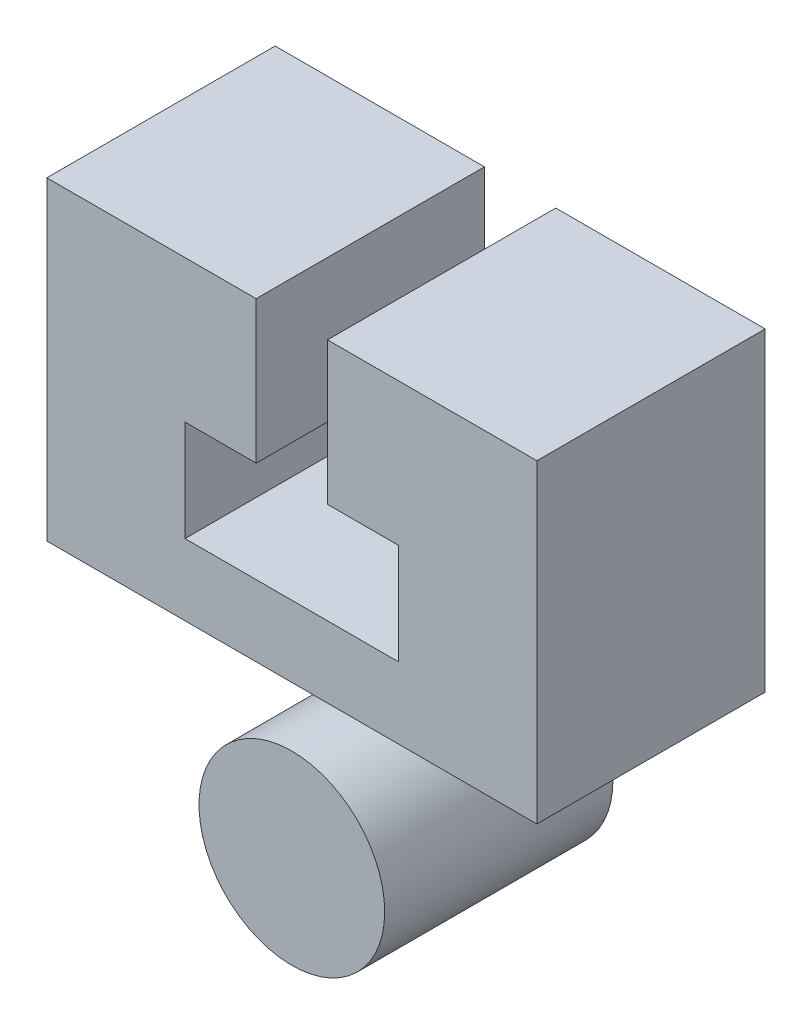
ISO-10303-21;
HEADER;
FILE_DESCRIPTION(('STEP AP214'),'2;1');
FILE_NAME('part.step','',(''),(''),'','','');
FILE_SCHEMA(('AUTOMOTIVE_DESIGN { 1 0 10303 214 1 1 1 1 }'));
ENDSEC;
DATA;
#1=APPLICATION_CONTEXT('core data for automotive mechanical design processes');
#2=APPLICATION_PROTOCOL_DEFINITION('international standard','automotive_design',2000,#1);
#3=PRODUCT_CONTEXT('',#1,'mechanical');
#4=PRODUCT('Part','Part','',(#3));
#5=PRODUCT_RELATED_PRODUCT_CATEGORY('part','',(#4));
#6=PRODUCT_DEFINITION_FORMATION('','',#4);
#7=PRODUCT_DEFINITION_CONTEXT('part definition',#1,'design');
#8=PRODUCT_DEFINITION('design','',#6,#7);
#9=PRODUCT_DEFINITION_SHAPE('','',#8);
#10=(LENGTH_UNIT() NAMED_UNIT(*) SI_UNIT(.MILLI.,.METRE.));
#11=(NAMED_UNIT(*) PLANE_ANGLE_UNIT() SI_UNIT($,.RADIAN.));
#12=(NAMED_UNIT(*) SI_UNIT($,.STERADIAN.) SOLID_ANGLE_UNIT());
#13=UNCERTAINTY_MEASURE_WITH_UNIT(LENGTH_MEASURE(1.E-05),#10,'distance_accuracy_value','');
#14=(GEOMETRIC_REPRESENTATION_CONTEXT(3) GLOBAL_UNCERTAINTY_ASSIGNED_CONTEXT((#13)) GLOBAL_UNIT_ASSIGNED_CONTEXT((#10,
#11,#12)) REPRESENTATION_CONTEXT('',''));
#15=CARTESIAN_POINT('',(0.,0.,0.));
#16=DIRECTION('',(0.,0.,1.));
#17=DIRECTION('',(1.,0.,0.));
#18=AXIS2_PLACEMENT_3D('',#15,#16,#17);
#19=CARTESIAN_POINT('',(40.894,77.9018,97.189073188502));
#20=DIRECTION('',(0.,1.,0.));
#21=DIRECTION('',(0.,0.,1.));
#22=AXIS2_PLACEMENT_3D('',#19,#20,#21);
#23=PLANE('',#22);
#24=DIRECTION('',(0.,0.,-1.));
#25=VECTOR('',#24,1.);
#26=CARTESIAN_POINT('',(-5.9554872,77.9018,0.));
#27=LINE('',#26,#25);
#28=CARTESIAN_POINT('',(-5.9554872,77.9018,0.));
#29=VERTEX_POINT('',#28);
#30=CARTESIAN_POINT('',(-5.9554872,77.9018,-38.1));
#31=VERTEX_POINT('',#30);
#32=EDGE_CURVE('E293',#29,#31,#27,.T.);
#33=ORIENTED_EDGE('',*,*,#32,.T.);
#34=DIRECTION('',(1.,0.,0.));
#35=VECTOR('',#34,1.);
#36=CARTESIAN_POINT('',(40.894,77.9018,-38.1));
#37=LINE('',#36,#35);
#38=CARTESIAN_POINT('',(-40.894,77.9018,-38.1));
#39=VERTEX_POINT('',#38);
#40=EDGE_CURVE('E239',#39,#31,#37,.T.);
#41=ORIENTED_EDGE('',*,*,#40,.F.);
#42=DIRECTION('',(0.,0.,-1.));
#43=VECTOR('',#42,1.);
#44=CARTESIAN_POINT('',(-40.894,77.9018,97.189073188502));
#45=LINE('',#44,#43);
#46=CARTESIAN_POINT('',(-40.894,77.9018,0.));
#47=VERTEX_POINT('',#46);
#48=EDGE_CURVE('E251',#47,#39,#45,.T.);
#49=ORIENTED_EDGE('',*,*,#48,.F.);
#50=DIRECTION('',(1.,0.,0.));
#51=VECTOR('',#50,1.);
#52=CARTESIAN_POINT('',(40.894,77.9018,0.));
#53=LINE('',#52,#51);
#54=EDGE_CURVE('E318',#47,#29,#53,.T.);
#55=ORIENTED_EDGE('',*,*,#54,.T.);
#56=EDGE_LOOP('',(#33,#41,#49,#55));
#57=FACE_BOUND('',#56,.T.);
#58=ADVANCED_FACE('F52',(#57),#23,.T.);
#59=CARTESIAN_POINT('',(0.,0.,-38.1));
#60=DIRECTION('',(0.,0.,1.));
#61=DIRECTION('',(1.,0.,0.));
#62=AXIS2_PLACEMENT_3D('',#59,#60,#61);
#63=CYLINDRICAL_SURFACE('',#62,15.494);
#64=CARTESIAN_POINT('',(0.,0.,-25.6032));
#65=DIRECTION('',(0.,0.,-1.));
#66=DIRECTION('',(-1.,0.,0.));
#67=AXIS2_PLACEMENT_3D('',#64,#65,#66);
#68=CIRCLE('',#67,15.494);
#69=CARTESIAN_POINT('',(15.494,0.,-25.6032));
#70=VERTEX_POINT('',#69);
#71=CARTESIAN_POINT('',(-15.494,0.,-25.6032));
#72=VERTEX_POINT('',#71);
#73=EDGE_CURVE('E434',#70,#72,#68,.F.);
#74=ORIENTED_EDGE('',*,*,#73,.T.);
#75=DIRECTION('',(0.,0.,-1.));
#76=VECTOR('',#75,1.);
#77=CARTESIAN_POINT('',(-15.494,0.,-30.6832));
#78=LINE('',#77,#76);
#79=CARTESIAN_POINT('',(-15.494,0.,-38.1));
#80=VERTEX_POINT('',#79);
#81=EDGE_CURVE('E412',#72,#80,#78,.T.);
#82=ORIENTED_EDGE('',*,*,#81,.T.);
#83=CARTESIAN_POINT('',(0.,0.,-38.1));
#84=DIRECTION('',(0.,0.,1.));
#85=DIRECTION('',(1.,0.,0.));
#86=AXIS2_PLACEMENT_3D('',#83,#84,#85);
#87=CIRCLE('',#86,15.494);
#88=CARTESIAN_POINT('',(15.494,0.,-38.1));
#89=VERTEX_POINT('',#88);
#90=EDGE_CURVE('E432',#80,#89,#87,.T.);
#91=ORIENTED_EDGE('',*,*,#90,.T.);
#92=DIRECTION('',(0.,0.,-1.));
#93=VECTOR('',#92,1.);
#94=CARTESIAN_POINT('',(15.494,0.,-30.6832));
#95=LINE('',#94,#93);
#96=EDGE_CURVE('E417',#70,#89,#95,.T.);
#97=ORIENTED_EDGE('',*,*,#96,.F.);
#98=EDGE_LOOP('',(#74,#82,#91,#97));
#99=FACE_BOUND('',#98,.T.);
#100=CARTESIAN_POINT('',(0.,0.,0.));
#101=DIRECTION('',(0.,0.,1.));
#102=DIRECTION('',(1.,0.,0.));
#103=AXIS2_PLACEMENT_3D('',#100,#101,#102);
#104=CIRCLE('',#103,15.494);
#105=CARTESIAN_POINT('',(15.494,0.,0.));
#106=VERTEX_POINT('',#105);
#107=EDGE_CURVE('E421',#106,#106,#104,.T.);
#108=ORIENTED_EDGE('',*,*,#107,.F.);
#109=EDGE_LOOP('',(#108));
#110=FACE_BOUND('',#109,.T.);
#111=ADVANCED_FACE('F355',(#99,#110),#63,.T.);
#112=CARTESIAN_POINT('',(0.,0.,-38.1));
#113=DIRECTION('',(0.,0.,1.));
#114=DIRECTION('',(1.,0.,0.));
#115=AXIS2_PLACEMENT_3D('',#112,#113,#114);
#116=PLANE('',#115);
#117=ORIENTED_EDGE('',*,*,#40,.T.);
#118=DIRECTION('',(0.,1.,0.));
#119=VECTOR('',#118,1.);
#120=CARTESIAN_POINT('',(-5.9554872,54.1274,-38.1));
#121=LINE('',#120,#119);
#122=CARTESIAN_POINT('',(-5.9554872,54.1274,-38.1));
#123=VERTEX_POINT('',#122);
#124=EDGE_CURVE('E207',#123,#31,#121,.T.);
#125=ORIENTED_EDGE('',*,*,#124,.F.);
#126=DIRECTION('',(1.,0.,0.));
#127=VECTOR('',#126,1.);
#128=CARTESIAN_POINT('',(-17.8308,54.1274,-38.1));
#129=LINE('',#128,#127);
#130=CARTESIAN_POINT('',(-17.8308,54.1274,-38.1));
#131=VERTEX_POINT('',#130);
#132=EDGE_CURVE('E210',#131,#123,#129,.T.);
#133=ORIENTED_EDGE('',*,*,#132,.F.);
#134=DIRECTION('',(0.,1.,0.));
#135=VECTOR('',#134,1.);
#136=CARTESIAN_POINT('',(-17.8308,37.2872,-38.1));
#137=LINE('',#136,#135);
#138=CARTESIAN_POINT('',(-17.8308,37.2872,-38.1));
#139=VERTEX_POINT('',#138);
#140=EDGE_CURVE('E283',#139,#131,#137,.T.);
#141=ORIENTED_EDGE('',*,*,#140,.F.);
#142=DIRECTION('',(-1.,0.,0.));
#143=VECTOR('',#142,1.);
#144=CARTESIAN_POINT('',(17.8308,37.2872,-38.1));
#145=LINE('',#144,#143);
#146=CARTESIAN_POINT('',(17.8308,37.2872,-38.1));
#147=VERTEX_POINT('',#146);
#148=EDGE_CURVE('E279',#147,#139,#145,.T.);
#149=ORIENTED_EDGE('',*,*,#148,.F.);
#150=DIRECTION('',(0.,-1.,0.));
#151=VECTOR('',#150,1.);
#152=CARTESIAN_POINT('',(17.8308,54.1274,-38.1));
#153=LINE('',#152,#151);
#154=CARTESIAN_POINT('',(17.8308,54.1274,-38.1));
#155=VERTEX_POINT('',#154);
#156=EDGE_CURVE('E271',#155,#147,#153,.T.);
#157=ORIENTED_EDGE('',*,*,#156,.F.);
#158=DIRECTION('',(1.,0.,0.));
#159=VECTOR('',#158,1.);
#160=CARTESIAN_POINT('',(5.94478872,54.1274,-38.1));
#161=LINE('',#160,#159);
#162=CARTESIAN_POINT('',(5.94478872,54.1274,-38.1));
#163=VERTEX_POINT('',#162);
#164=EDGE_CURVE('E273',#163,#155,#161,.T.);
#165=ORIENTED_EDGE('',*,*,#164,.F.);
#166=DIRECTION('',(0.,-1.,0.));
#167=VECTOR('',#166,1.);
#168=CARTESIAN_POINT('',(5.94478872,77.9018,-38.1));
#169=LINE('',#168,#167);
#170=CARTESIAN_POINT('',(5.94478872,77.9018,-38.1));
#171=VERTEX_POINT('',#170);
#172=EDGE_CURVE('E184',#171,#163,#169,.T.);
#173=ORIENTED_EDGE('',*,*,#172,.F.);
#174=CARTESIAN_POINT('',(40.894,77.9018,-38.1));
#175=VERTEX_POINT('',#174);
#176=EDGE_CURVE('E243',#171,#175,#37,.T.);
#177=ORIENTED_EDGE('',*,*,#176,.T.);
#178=DIRECTION('',(0.,-1.,0.));
#179=VECTOR('',#178,1.);
#180=CARTESIAN_POINT('',(40.894,25.4,-38.1));
#181=LINE('',#180,#179);
#182=CARTESIAN_POINT('',(40.894,25.4,-38.1));
#183=VERTEX_POINT('',#182);
#184=EDGE_CURVE('E234',#175,#183,#181,.T.);
#185=ORIENTED_EDGE('',*,*,#184,.T.);
#186=DIRECTION('',(-1.,0.,0.));
#187=VECTOR('',#186,1.);
#188=CARTESIAN_POINT('',(15.494,25.4,-38.1));
#189=LINE('',#188,#187);
#190=CARTESIAN_POINT('',(15.494,25.4,-38.1));
#191=VERTEX_POINT('',#190);
#192=EDGE_CURVE('E228',#183,#191,#189,.T.);
#193=ORIENTED_EDGE('',*,*,#192,.T.);
#194=DIRECTION('',(0.,-1.,0.));
#195=VECTOR('',#194,1.);
#196=CARTESIAN_POINT('',(15.494,0.,-38.1));
#197=LINE('',#196,#195);
#198=EDGE_CURVE('E399',#191,#89,#197,.T.);
#199=ORIENTED_EDGE('',*,*,#198,.T.);
#200=ORIENTED_EDGE('',*,*,#90,.F.);
#201=DIRECTION('',(0.,1.,0.));
#202=VECTOR('',#201,1.);
#203=CARTESIAN_POINT('',(-15.494,25.4,-38.1));
#204=LINE('',#203,#202);
#205=CARTESIAN_POINT('',(-15.494,25.4,-38.1));
#206=VERTEX_POINT('',#205);
#207=EDGE_CURVE('E393',#80,#206,#204,.T.);
#208=ORIENTED_EDGE('',*,*,#207,.T.);
#209=CARTESIAN_POINT('',(-40.894,25.4,-38.1));
#210=VERTEX_POINT('',#209);
#211=EDGE_CURVE('E233',#206,#210,#189,.T.);
#212=ORIENTED_EDGE('',*,*,#211,.T.);
#213=DIRECTION('',(0.,1.,0.));
#214=VECTOR('',#213,1.);
#215=CARTESIAN_POINT('',(-40.894,77.9018,-38.1));
#216=LINE('',#215,#214);
#217=EDGE_CURVE('E232',#210,#39,#216,.T.);
#218=ORIENTED_EDGE('',*,*,#217,.T.);
#219=EDGE_LOOP('',(#117,#125,#133,#141,#149,#157,#165,#173,#177,#185,#193,#199,#200,#208,#212,#218));
#220=FACE_BOUND('',#219,.T.);
#221=ADVANCED_FACE('F277',(#220),#116,.F.);
#222=CARTESIAN_POINT('',(0.,0.,0.));
#223=DIRECTION('',(0.,0.,1.));
#224=DIRECTION('',(1.,0.,0.));
#225=AXIS2_PLACEMENT_3D('',#222,#223,#224);
#226=PLANE('',#225);
#227=ORIENTED_EDGE('',*,*,#107,.T.);
#228=EDGE_LOOP('',(#227));
#229=FACE_BOUND('',#228,.T.);
#230=ADVANCED_FACE('F458',(#229),#226,.T.);
#231=CARTESIAN_POINT('',(15.494,0.,-30.6832));
#232=DIRECTION('',(1.,0.,0.));
#233=DIRECTION('',(0.,0.,-1.));
#234=AXIS2_PLACEMENT_3D('',#231,#232,#233);
#235=PLANE('',#234);
#236=ORIENTED_EDGE('',*,*,#198,.F.);
#237=DIRECTION('',(0.,0.,-1.));
#238=VECTOR('',#237,1.);
#239=CARTESIAN_POINT('',(15.494,25.4,-30.6832));
#240=LINE('',#239,#238);
#241=CARTESIAN_POINT('',(15.494,25.4,-30.6832));
#242=VERTEX_POINT('',#241);
#243=EDGE_CURVE('E422',#242,#191,#240,.T.);
#244=ORIENTED_EDGE('',*,*,#243,.F.);
#245=DIRECTION('',(0.,-1.,0.));
#246=VECTOR('',#245,1.);
#247=CARTESIAN_POINT('',(15.494,0.,-30.6832));
#248=LINE('',#247,#246);
#249=CARTESIAN_POINT('',(15.494,13.5360791959858,-30.6832));
#250=VERTEX_POINT('',#249);
#251=EDGE_CURVE('E410',#242,#250,#248,.T.);
#252=ORIENTED_EDGE('',*,*,#251,.T.);
#253=CARTESIAN_POINT('',(15.494,13.5360791959858,-30.6832));
#254=CARTESIAN_POINT('',(15.494,13.3421272709523,-30.6831931030834));
#255=CARTESIAN_POINT('',(15.494,13.1482261054772,-30.6783928912099));
#256=CARTESIAN_POINT('',(15.494,12.7609153638539,-30.6598653900687));
#257=CARTESIAN_POINT('',(15.494,12.5675056366207,-30.646141295976));
#258=CARTESIAN_POINT('',(15.494,11.9892506565346,-30.5926459259166));
#259=CARTESIAN_POINT('',(15.494,11.6055123749205,-30.5405455888845));
#260=CARTESIAN_POINT('',(15.494,10.8484999570026,-30.4091153210755));
#261=CARTESIAN_POINT('',(15.494,10.4751545993975,-30.3301820572617));
#262=CARTESIAN_POINT('',(15.494,9.73402635991413,-30.1488851474403));
#263=CARTESIAN_POINT('',(15.494,9.36624686018778,-30.0465078203666));
#264=CARTESIAN_POINT('',(15.494,8.60547247148766,-29.8122329075534));
#265=CARTESIAN_POINT('',(15.494,8.21303130981734,-29.6785530886733));
#266=CARTESIAN_POINT('',(15.494,7.43526363483879,-29.3917523714856));
#267=CARTESIAN_POINT('',(15.494,7.04993914296578,-29.2386260439419));
#268=CARTESIAN_POINT('',(15.494,6.28574403572504,-28.9163866771008));
#269=CARTESIAN_POINT('',(15.494,5.90687845510789,-28.7472617841115));
#270=CARTESIAN_POINT('',(15.494,5.15507440637771,-28.3962644606188));
#271=CARTESIAN_POINT('',(15.494,4.78213675610768,-28.2143902895777));
#272=CARTESIAN_POINT('',(15.494,3.66624790854189,-27.65171831166));
#273=CARTESIAN_POINT('',(15.494,2.93090574089442,-27.2559282762233));
#274=CARTESIAN_POINT('',(15.494,1.47089475384428,-26.4453151102772));
#275=CARTESIAN_POINT('',(15.494,0.746228260195783,-26.030487911109));
#276=CARTESIAN_POINT('',(15.494,0.0144026681147942,-25.6114469428914));
#277=CARTESIAN_POINT('',(15.494,0.00720133460943791,-25.6073234712985));
#278=CARTESIAN_POINT('',(15.494,0.,-25.6032));
#279=B_SPLINE_CURVE_WITH_KNOTS('',3,(#253,#254,#255,#256,#257,#258,#259,#260,#261,#262,#263,
#264,#265,#266,#267,#268,#269,#270,#271,#272,#273,#274,#275,#276,#277,#278),.UNSPECIFIED.,.F.,
.F.,(4,2,2,2,2,2,2,2,2,2,2,2,4),(0.,0.581713359913225,1.16321855332281,2.32363643204806,
3.46759653804617,4.61222592469933,5.85535820072218,7.09883831077744,8.34324706879805,
9.58782604622115,12.0923097935322,14.5973313195761,14.6222262989917),.UNSPECIFIED.);
#280=EDGE_CURVE('E12',#250,#70,#279,.T.);
#281=ORIENTED_EDGE('',*,*,#280,.T.);
#282=ORIENTED_EDGE('',*,*,#96,.T.);
#283=EDGE_LOOP('',(#236,#244,#252,#281,#282));
#284=FACE_BOUND('',#283,.T.);
#285=ADVANCED_FACE('F454',(#284),#235,.T.);
#286=CARTESIAN_POINT('',(-15.494,25.4,-30.6832));
#287=DIRECTION('',(-1.,0.,0.));
#288=DIRECTION('',(0.,0.,1.));
#289=AXIS2_PLACEMENT_3D('',#286,#287,#288);
#290=PLANE('',#289);
#291=ORIENTED_EDGE('',*,*,#207,.F.);
#292=ORIENTED_EDGE('',*,*,#81,.F.);
#293=CARTESIAN_POINT('',(-15.494,13.5360791959858,-30.6832));
#294=CARTESIAN_POINT('',(-15.494,13.3421272709523,-30.6831931030834));
#295=CARTESIAN_POINT('',(-15.494,13.1482261054772,-30.6783928912099));
#296=CARTESIAN_POINT('',(-15.494,12.7609153638539,-30.6598653900687));
#297=CARTESIAN_POINT('',(-15.494,12.5675056366207,-30.646141295976));
#298=CARTESIAN_POINT('',(-15.494,11.9892506565346,-30.5926459259166));
#299=CARTESIAN_POINT('',(-15.494,11.6055123749205,-30.5405455888845));
#300=CARTESIAN_POINT('',(-15.494,10.8484999570026,-30.4091153210755));
#301=CARTESIAN_POINT('',(-15.494,10.4751545993975,-30.3301820572617));
#302=CARTESIAN_POINT('',(-15.494,9.73402635991413,-30.1488851474403));
#303=CARTESIAN_POINT('',(-15.494,9.36624686018778,-30.0465078203666));
#304=CARTESIAN_POINT('',(-15.494,8.60547247148766,-29.8122329075534));
#305=CARTESIAN_POINT('',(-15.494,8.21303130981734,-29.6785530886733));
#306=CARTESIAN_POINT('',(-15.494,7.43526363483879,-29.3917523714856));
#307=CARTESIAN_POINT('',(-15.494,7.04993914296578,-29.2386260439419));
#308=CARTESIAN_POINT('',(-15.494,6.28574403572504,-28.9163866771008));
#309=CARTESIAN_POINT('',(-15.494,5.90687845510789,-28.7472617841115));
#310=CARTESIAN_POINT('',(-15.494,5.15507440637771,-28.3962644606188));
#311=CARTESIAN_POINT('',(-15.494,4.78213675610768,-28.2143902895777));
#312=CARTESIAN_POINT('',(-15.494,3.66624790854189,-27.65171831166));
#313=CARTESIAN_POINT('',(-15.494,2.93090574089442,-27.2559282762233));
#314=CARTESIAN_POINT('',(-15.494,1.47089475384428,-26.4453151102772));
#315=CARTESIAN_POINT('',(-15.494,0.746228260195783,-26.030487911109));
#316=CARTESIAN_POINT('',(-15.494,0.0144026681147942,-25.6114469428914));
#317=CARTESIAN_POINT('',(-15.494,0.00720133460943791,-25.6073234712985));
#318=CARTESIAN_POINT('',(-15.494,0.,-25.6032));
#319=B_SPLINE_CURVE_WITH_KNOTS('',3,(#293,#294,#295,#296,#297,#298,#299,#300,#301,#302,#303,
#304,#305,#306,#307,#308,#309,#310,#311,#312,#313,#314,#315,#316,#317,#318),.UNSPECIFIED.,.F.,
.F.,(4,2,2,2,2,2,2,2,2,2,2,2,4),(0.,0.581713359913225,1.16321855332281,2.32363643204806,
3.46759653804617,4.61222592469933,5.85535820072218,7.09883831077744,8.34324706879805,
9.58782604622115,12.0923097935322,14.5973313195761,14.6222262989917),.UNSPECIFIED.);
#320=CARTESIAN_POINT('',(-15.494,13.5360791959858,-30.6832));
#321=VERTEX_POINT('',#320);
#322=EDGE_CURVE('E67',#72,#321,#319,.F.);
#323=ORIENTED_EDGE('',*,*,#322,.T.);
#324=DIRECTION('',(0.,1.,0.));
#325=VECTOR('',#324,1.);
#326=CARTESIAN_POINT('',(-15.494,25.4,-30.6832));
#327=LINE('',#326,#325);
#328=CARTESIAN_POINT('',(-15.494,25.4,-30.6832));
#329=VERTEX_POINT('',#328);
#330=EDGE_CURVE('E403',#321,#329,#327,.T.);
#331=ORIENTED_EDGE('',*,*,#330,.T.);
#332=DIRECTION('',(0.,0.,-1.));
#333=VECTOR('',#332,1.);
#334=CARTESIAN_POINT('',(-15.494,25.4,-30.6832));
#335=LINE('',#334,#333);
#336=EDGE_CURVE('E426',#329,#206,#335,.T.);
#337=ORIENTED_EDGE('',*,*,#336,.T.);
#338=EDGE_LOOP('',(#291,#292,#323,#331,#337));
#339=FACE_BOUND('',#338,.T.);
#340=ADVANCED_FACE('F449',(#339),#290,.T.);
#341=CARTESIAN_POINT('',(0.,0.,-30.6832));
#342=DIRECTION('',(0.,0.,-1.));
#343=DIRECTION('',(-1.,0.,0.));
#344=AXIS2_PLACEMENT_3D('',#341,#342,#343);
#345=PLANE('',#344);
#346=ORIENTED_EDGE('',*,*,#330,.F.);
#347=CARTESIAN_POINT('',(0.,0.,-30.6832));
#348=DIRECTION('',(0.,0.,-1.));
#349=DIRECTION('',(-1.,0.,0.));
#350=AXIS2_PLACEMENT_3D('',#347,#348,#349);
#351=CIRCLE('',#350,20.574);
#352=EDGE_CURVE('E80',#321,#250,#351,.T.);
#353=ORIENTED_EDGE('',*,*,#352,.T.);
#354=ORIENTED_EDGE('',*,*,#251,.F.);
#355=DIRECTION('',(1.,0.,0.));
#356=VECTOR('',#355,1.);
#357=CARTESIAN_POINT('',(15.494,25.4,-30.6832));
#358=LINE('',#357,#356);
#359=EDGE_CURVE('E406',#329,#242,#358,.T.);
#360=ORIENTED_EDGE('',*,*,#359,.F.);
#361=EDGE_LOOP('',(#346,#353,#354,#360));
#362=FACE_BOUND('',#361,.T.);
#363=ADVANCED_FACE('F453',(#362),#345,.F.);
#364=CARTESIAN_POINT('',(15.494,25.4,97.189073188502));
#365=DIRECTION('',(0.,-1.,0.));
#366=DIRECTION('',(0.,0.,-1.));
#367=AXIS2_PLACEMENT_3D('',#364,#365,#366);
#368=PLANE('',#367);
#369=ORIENTED_EDGE('',*,*,#336,.F.);
#370=ORIENTED_EDGE('',*,*,#359,.T.);
#371=ORIENTED_EDGE('',*,*,#243,.T.);
#372=ORIENTED_EDGE('',*,*,#192,.F.);
#373=DIRECTION('',(0.,0.,-1.));
#374=VECTOR('',#373,1.);
#375=CARTESIAN_POINT('',(40.894,25.4,97.189073188502));
#376=LINE('',#375,#374);
#377=CARTESIAN_POINT('',(40.894,25.4,0.));
#378=VERTEX_POINT('',#377);
#379=EDGE_CURVE('E329',#378,#183,#376,.T.);
#380=ORIENTED_EDGE('',*,*,#379,.F.);
#381=DIRECTION('',(-1.,0.,0.));
#382=VECTOR('',#381,1.);
#383=CARTESIAN_POINT('',(15.494,25.4,0.));
#384=LINE('',#383,#382);
#385=CARTESIAN_POINT('',(-40.894,25.4,0.));
#386=VERTEX_POINT('',#385);
#387=EDGE_CURVE('E252',#378,#386,#384,.T.);
#388=ORIENTED_EDGE('',*,*,#387,.T.);
#389=DIRECTION('',(0.,0.,-1.));
#390=VECTOR('',#389,1.);
#391=CARTESIAN_POINT('',(-40.894,25.4,97.189073188502));
#392=LINE('',#391,#390);
#393=EDGE_CURVE('E389',#386,#210,#392,.T.);
#394=ORIENTED_EDGE('',*,*,#393,.T.);
#395=ORIENTED_EDGE('',*,*,#211,.F.);
#396=EDGE_LOOP('',(#369,#370,#371,#372,#380,#388,#394,#395));
#397=FACE_BOUND('',#396,.T.);
#398=ADVANCED_FACE('F472',(#397),#368,.T.);
#399=CARTESIAN_POINT('',(0.,0.,0.));
#400=DIRECTION('',(0.,0.,1.));
#401=DIRECTION('',(1.,0.,0.));
#402=AXIS2_PLACEMENT_3D('',#399,#400,#401);
#403=PLANE('',#402);
#404=DIRECTION('',(0.,1.,0.));
#405=VECTOR('',#404,1.);
#406=CARTESIAN_POINT('',(-5.9554872,54.1274,0.));
#407=LINE('',#406,#405);
#408=CARTESIAN_POINT('',(-5.9554872,54.1274,0.));
#409=VERTEX_POINT('',#408);
#410=EDGE_CURVE('E227',#409,#29,#407,.T.);
#411=ORIENTED_EDGE('',*,*,#410,.T.);
#412=ORIENTED_EDGE('',*,*,#54,.F.);
#413=DIRECTION('',(0.,1.,0.));
#414=VECTOR('',#413,1.);
#415=CARTESIAN_POINT('',(-40.894,77.9018,0.));
#416=LINE('',#415,#414);
#417=EDGE_CURVE('E238',#386,#47,#416,.T.);
#418=ORIENTED_EDGE('',*,*,#417,.F.);
#419=ORIENTED_EDGE('',*,*,#387,.F.);
#420=DIRECTION('',(0.,-1.,0.));
#421=VECTOR('',#420,1.);
#422=CARTESIAN_POINT('',(40.894,25.4,0.));
#423=LINE('',#422,#421);
#424=CARTESIAN_POINT('',(40.894,77.9018,0.));
#425=VERTEX_POINT('',#424);
#426=EDGE_CURVE('E325',#425,#378,#423,.T.);
#427=ORIENTED_EDGE('',*,*,#426,.F.);
#428=CARTESIAN_POINT('',(5.94478872,77.9018,0.));
#429=VERTEX_POINT('',#428);
#430=EDGE_CURVE('E205',#429,#425,#53,.T.);
#431=ORIENTED_EDGE('',*,*,#430,.F.);
#432=DIRECTION('',(0.,-1.,0.));
#433=VECTOR('',#432,1.);
#434=CARTESIAN_POINT('',(5.94478872,77.9018,0.));
#435=LINE('',#434,#433);
#436=CARTESIAN_POINT('',(5.94478872,54.1274,0.));
#437=VERTEX_POINT('',#436);
#438=EDGE_CURVE('E181',#429,#437,#435,.T.);
#439=ORIENTED_EDGE('',*,*,#438,.T.);
#440=DIRECTION('',(1.,0.,0.));
#441=VECTOR('',#440,1.);
#442=CARTESIAN_POINT('',(5.94478872,54.1274,0.));
#443=LINE('',#442,#441);
#444=CARTESIAN_POINT('',(17.8308,54.1274,0.));
#445=VERTEX_POINT('',#444);
#446=EDGE_CURVE('E193',#437,#445,#443,.T.);
#447=ORIENTED_EDGE('',*,*,#446,.T.);
#448=DIRECTION('',(0.,-1.,0.));
#449=VECTOR('',#448,1.);
#450=CARTESIAN_POINT('',(17.8308,54.1274,0.));
#451=LINE('',#450,#449);
#452=CARTESIAN_POINT('',(17.8308,37.2872,0.));
#453=VERTEX_POINT('',#452);
#454=EDGE_CURVE('E199',#445,#453,#451,.T.);
#455=ORIENTED_EDGE('',*,*,#454,.T.);
#456=DIRECTION('',(-1.,0.,0.));
#457=VECTOR('',#456,1.);
#458=CARTESIAN_POINT('',(17.8308,37.2872,0.));
#459=LINE('',#458,#457);
#460=CARTESIAN_POINT('',(-17.8308,37.2872,0.));
#461=VERTEX_POINT('',#460);
#462=EDGE_CURVE('E340',#453,#461,#459,.T.);
#463=ORIENTED_EDGE('',*,*,#462,.T.);
#464=DIRECTION('',(0.,1.,0.));
#465=VECTOR('',#464,1.);
#466=CARTESIAN_POINT('',(-17.8308,37.2872,0.));
#467=LINE('',#466,#465);
#468=CARTESIAN_POINT('',(-17.8308,54.1274,0.));
#469=VERTEX_POINT('',#468);
#470=EDGE_CURVE('E337',#461,#469,#467,.T.);
#471=ORIENTED_EDGE('',*,*,#470,.T.);
#472=DIRECTION('',(1.,0.,0.));
#473=VECTOR('',#472,1.);
#474=CARTESIAN_POINT('',(-17.8308,54.1274,0.));
#475=LINE('',#474,#473);
#476=EDGE_CURVE('E308',#469,#409,#475,.T.);
#477=ORIENTED_EDGE('',*,*,#476,.T.);
#478=EDGE_LOOP('',(#411,#412,#418,#419,#427,#431,#439,#447,#455,#463,#471,#477));
#479=FACE_BOUND('',#478,.T.);
#480=ADVANCED_FACE('F203',(#479),#403,.T.);
#481=CARTESIAN_POINT('',(-40.894,77.9018,97.189073188502));
#482=DIRECTION('',(-1.,0.,0.));
#483=DIRECTION('',(0.,0.,1.));
#484=AXIS2_PLACEMENT_3D('',#481,#482,#483);
#485=PLANE('',#484);
#486=ORIENTED_EDGE('',*,*,#393,.F.);
#487=ORIENTED_EDGE('',*,*,#417,.T.);
#488=ORIENTED_EDGE('',*,*,#48,.T.);
#489=ORIENTED_EDGE('',*,*,#217,.F.);
#490=EDGE_LOOP('',(#486,#487,#488,#489));
#491=FACE_BOUND('',#490,.T.);
#492=ADVANCED_FACE('F368',(#491),#485,.T.);
#493=DIRECTION('',(0.,0.,-1.));
#494=VECTOR('',#493,1.);
#495=CARTESIAN_POINT('',(5.94478872,77.9018,0.));
#496=LINE('',#495,#494);
#497=EDGE_CURVE('E190',#429,#171,#496,.T.);
#498=ORIENTED_EDGE('',*,*,#497,.F.);
#499=ORIENTED_EDGE('',*,*,#430,.T.);
#500=DIRECTION('',(0.,0.,-1.));
#501=VECTOR('',#500,1.);
#502=CARTESIAN_POINT('',(40.894,77.9018,97.189073188502));
#503=LINE('',#502,#501);
#504=EDGE_CURVE('E320',#425,#175,#503,.T.);
#505=ORIENTED_EDGE('',*,*,#504,.T.);
#506=ORIENTED_EDGE('',*,*,#176,.F.);
#507=EDGE_LOOP('',(#498,#499,#505,#506));
#508=FACE_BOUND('',#507,.T.);
#509=ADVANCED_FACE('F357',(#508),#23,.T.);
#510=CARTESIAN_POINT('',(40.894,25.4,97.189073188502));
#511=DIRECTION('',(1.,0.,0.));
#512=DIRECTION('',(0.,0.,-1.));
#513=AXIS2_PLACEMENT_3D('',#510,#511,#512);
#514=PLANE('',#513);
#515=ORIENTED_EDGE('',*,*,#504,.F.);
#516=ORIENTED_EDGE('',*,*,#426,.T.);
#517=ORIENTED_EDGE('',*,*,#379,.T.);
#518=ORIENTED_EDGE('',*,*,#184,.F.);
#519=EDGE_LOOP('',(#515,#516,#517,#518));
#520=FACE_BOUND('',#519,.T.);
#521=ADVANCED_FACE('F367',(#520),#514,.T.);
#522=CARTESIAN_POINT('',(-5.9554872,54.1274,0.));
#523=DIRECTION('',(-1.,0.,0.));
#524=DIRECTION('',(0.,-1.,0.));
#525=AXIS2_PLACEMENT_3D('',#522,#523,#524);
#526=PLANE('',#525);
#527=ORIENTED_EDGE('',*,*,#124,.T.);
#528=ORIENTED_EDGE('',*,*,#32,.F.);
#529=ORIENTED_EDGE('',*,*,#410,.F.);
#530=DIRECTION('',(0.,0.,-1.));
#531=VECTOR('',#530,1.);
#532=CARTESIAN_POINT('',(-5.9554872,54.1274,0.));
#533=LINE('',#532,#531);
#534=EDGE_CURVE('E296',#409,#123,#533,.T.);
#535=ORIENTED_EDGE('',*,*,#534,.T.);
#536=EDGE_LOOP('',(#527,#528,#529,#535));
#537=FACE_BOUND('',#536,.T.);
#538=ADVANCED_FACE('F314',(#537),#526,.F.);
#539=CARTESIAN_POINT('',(-17.8308,54.1274,0.));
#540=DIRECTION('',(0.,1.,0.));
#541=DIRECTION('',(0.,0.,1.));
#542=AXIS2_PLACEMENT_3D('',#539,#540,#541);
#543=PLANE('',#542);
#544=ORIENTED_EDGE('',*,*,#132,.T.);
#545=ORIENTED_EDGE('',*,*,#534,.F.);
#546=ORIENTED_EDGE('',*,*,#476,.F.);
#547=DIRECTION('',(0.,0.,-1.));
#548=VECTOR('',#547,1.);
#549=CARTESIAN_POINT('',(-17.8308,54.1274,0.));
#550=LINE('',#549,#548);
#551=EDGE_CURVE('E260',#469,#131,#550,.T.);
#552=ORIENTED_EDGE('',*,*,#551,.T.);
#553=EDGE_LOOP('',(#544,#545,#546,#552));
#554=FACE_BOUND('',#553,.T.);
#555=ADVANCED_FACE('F304',(#554),#543,.F.);
#556=CARTESIAN_POINT('',(-17.8308,37.2872,0.));
#557=DIRECTION('',(-1.,0.,0.));
#558=DIRECTION('',(0.,-1.,0.));
#559=AXIS2_PLACEMENT_3D('',#556,#557,#558);
#560=PLANE('',#559);
#561=ORIENTED_EDGE('',*,*,#140,.T.);
#562=ORIENTED_EDGE('',*,*,#551,.F.);
#563=ORIENTED_EDGE('',*,*,#470,.F.);
#564=DIRECTION('',(0.,0.,-1.));
#565=VECTOR('',#564,1.);
#566=CARTESIAN_POINT('',(-17.8308,37.2872,0.));
#567=LINE('',#566,#565);
#568=EDGE_CURVE('E256',#461,#139,#567,.T.);
#569=ORIENTED_EDGE('',*,*,#568,.T.);
#570=EDGE_LOOP('',(#561,#562,#563,#569));
#571=FACE_BOUND('',#570,.T.);
#572=ADVANCED_FACE('F312',(#571),#560,.F.);
#573=CARTESIAN_POINT('',(17.8308,37.2872,0.));
#574=DIRECTION('',(0.,-1.,0.));
#575=DIRECTION('',(0.,0.,-1.));
#576=AXIS2_PLACEMENT_3D('',#573,#574,#575);
#577=PLANE('',#576);
#578=ORIENTED_EDGE('',*,*,#148,.T.);
#579=ORIENTED_EDGE('',*,*,#568,.F.);
#580=ORIENTED_EDGE('',*,*,#462,.F.);
#581=DIRECTION('',(0.,0.,-1.));
#582=VECTOR('',#581,1.);
#583=CARTESIAN_POINT('',(17.8308,37.2872,0.));
#584=LINE('',#583,#582);
#585=EDGE_CURVE('E261',#453,#147,#584,.T.);
#586=ORIENTED_EDGE('',*,*,#585,.T.);
#587=EDGE_LOOP('',(#578,#579,#580,#586));
#588=FACE_BOUND('',#587,.T.);
#589=ADVANCED_FACE('F345',(#588),#577,.F.);
#590=CARTESIAN_POINT('',(17.8308,54.1274,0.));
#591=DIRECTION('',(1.,0.,0.));
#592=DIRECTION('',(0.,1.,0.));
#593=AXIS2_PLACEMENT_3D('',#590,#591,#592);
#594=PLANE('',#593);
#595=ORIENTED_EDGE('',*,*,#156,.T.);
#596=ORIENTED_EDGE('',*,*,#585,.F.);
#597=ORIENTED_EDGE('',*,*,#454,.F.);
#598=DIRECTION('',(0.,0.,-1.));
#599=VECTOR('',#598,1.);
#600=CARTESIAN_POINT('',(17.8308,54.1274,0.));
#601=LINE('',#600,#599);
#602=EDGE_CURVE('E189',#445,#155,#601,.T.);
#603=ORIENTED_EDGE('',*,*,#602,.T.);
#604=EDGE_LOOP('',(#595,#596,#597,#603));
#605=FACE_BOUND('',#604,.T.);
#606=ADVANCED_FACE('F269',(#605),#594,.F.);
#607=CARTESIAN_POINT('',(5.94478872,54.1274,0.));
#608=DIRECTION('',(0.,1.,0.));
#609=DIRECTION('',(0.,0.,1.));
#610=AXIS2_PLACEMENT_3D('',#607,#608,#609);
#611=PLANE('',#610);
#612=ORIENTED_EDGE('',*,*,#164,.T.);
#613=ORIENTED_EDGE('',*,*,#602,.F.);
#614=ORIENTED_EDGE('',*,*,#446,.F.);
#615=DIRECTION('',(0.,0.,-1.));
#616=VECTOR('',#615,1.);
#617=CARTESIAN_POINT('',(5.94478872,54.1274,0.));
#618=LINE('',#617,#616);
#619=EDGE_CURVE('E177',#437,#163,#618,.T.);
#620=ORIENTED_EDGE('',*,*,#619,.T.);
#621=EDGE_LOOP('',(#612,#613,#614,#620));
#622=FACE_BOUND('',#621,.T.);
#623=ADVANCED_FACE('F194',(#622),#611,.F.);
#624=CARTESIAN_POINT('',(5.94478872,77.9018,0.));
#625=DIRECTION('',(1.,0.,0.));
#626=DIRECTION('',(0.,1.,0.));
#627=AXIS2_PLACEMENT_3D('',#624,#625,#626);
#628=PLANE('',#627);
#629=ORIENTED_EDGE('',*,*,#172,.T.);
#630=ORIENTED_EDGE('',*,*,#619,.F.);
#631=ORIENTED_EDGE('',*,*,#438,.F.);
#632=ORIENTED_EDGE('',*,*,#497,.T.);
#633=EDGE_LOOP('',(#629,#630,#631,#632));
#634=FACE_BOUND('',#633,.T.);
#635=ADVANCED_FACE('F179',(#634),#628,.F.);
#636=CARTESIAN_POINT('',(0.,0.,-25.6032));
#637=DIRECTION('',(0.,0.,-1.));
#638=DIRECTION('',(-1.,0.,0.));
#639=AXIS2_PLACEMENT_3D('',#636,#637,#638);
#640=TOROIDAL_SURFACE('',#639,20.574,5.08);
#641=ORIENTED_EDGE('',*,*,#280,.F.);
#642=ORIENTED_EDGE('',*,*,#352,.F.);
#643=ORIENTED_EDGE('',*,*,#322,.F.);
#644=ORIENTED_EDGE('',*,*,#73,.F.);
#645=EDGE_LOOP('',(#641,#642,#643,#644));
#646=FACE_BOUND('',#645,.T.);
#647=ADVANCED_FACE('F54',(#646),#640,.F.);
#648=CLOSED_SHELL('',(#58,#111,#221,#230,#285,#340,#363,#398,#480,#492,#509,#521,#538,#555,#572,
#589,#606,#623,#635,#647));
#649=MANIFOLD_SOLID_BREP('B2',#648);
#650=ADVANCED_BREP_SHAPE_REPRESENTATION('',(#18,#649),#14);
#651=SHAPE_DEFINITION_REPRESENTATION(#9,#650);
ENDSEC;
END-ISO-10303-21;
